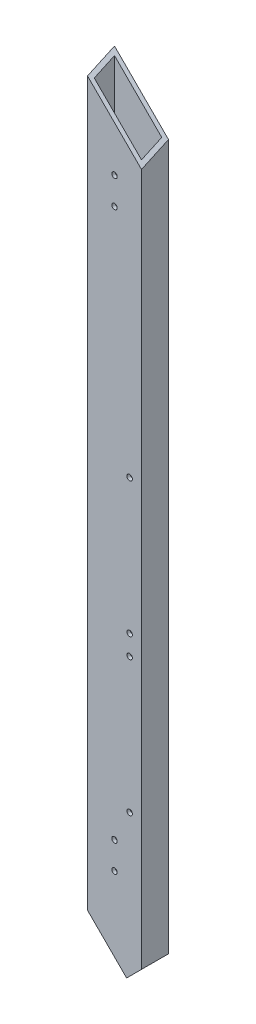
ISO-10303-21;
HEADER;
FILE_DESCRIPTION(('STEP AP214'),'2;1');
FILE_NAME('part.step','',(''),(''),'','','');
FILE_SCHEMA(('AUTOMOTIVE_DESIGN { 1 0 10303 214 1 1 1 1 }'));
ENDSEC;
DATA;
#1=APPLICATION_CONTEXT('core data for automotive mechanical design processes');
#2=APPLICATION_PROTOCOL_DEFINITION('international standard','automotive_design',2000,#1);
#3=PRODUCT_CONTEXT('',#1,'mechanical');
#4=PRODUCT('Part','Part','',(#3));
#5=PRODUCT_RELATED_PRODUCT_CATEGORY('part','',(#4));
#6=PRODUCT_DEFINITION_FORMATION('','',#4);
#7=PRODUCT_DEFINITION_CONTEXT('part definition',#1,'design');
#8=PRODUCT_DEFINITION('design','',#6,#7);
#9=PRODUCT_DEFINITION_SHAPE('','',#8);
#10=(LENGTH_UNIT() NAMED_UNIT(*) SI_UNIT(.MILLI.,.METRE.));
#11=(NAMED_UNIT(*) PLANE_ANGLE_UNIT() SI_UNIT($,.RADIAN.));
#12=(NAMED_UNIT(*) SI_UNIT($,.STERADIAN.) SOLID_ANGLE_UNIT());
#13=UNCERTAINTY_MEASURE_WITH_UNIT(LENGTH_MEASURE(1.E-05),#10,'distance_accuracy_value','');
#14=(GEOMETRIC_REPRESENTATION_CONTEXT(3) GLOBAL_UNCERTAINTY_ASSIGNED_CONTEXT((#13)) GLOBAL_UNIT_ASSIGNED_CONTEXT((#10,
#11,#12)) REPRESENTATION_CONTEXT('',''));
#15=CARTESIAN_POINT('',(0.,0.,0.));
#16=DIRECTION('',(0.,0.,1.));
#17=DIRECTION('',(1.,0.,0.));
#18=AXIS2_PLACEMENT_3D('',#15,#16,#17);
#19=CARTESIAN_POINT('',(25.4,728.3704,12.7));
#20=DIRECTION('',(-1.,0.,0.));
#21=DIRECTION('',(0.,0.,-1.));
#22=AXIS2_PLACEMENT_3D('',#19,#20,#21);
#23=PLANE('',#22);
#24=DIRECTION('',(0.,-1.,0.));
#25=VECTOR('',#24,1.);
#26=CARTESIAN_POINT('',(25.4,728.3704,38.1));
#27=LINE('',#26,#25);
#28=CARTESIAN_POINT('',(25.4,665.898951636196,38.1));
#29=VERTEX_POINT('',#28);
#30=CARTESIAN_POINT('',(25.4,13.9954000000001,38.1));
#31=VERTEX_POINT('',#30);
#32=EDGE_CURVE('E40',#29,#31,#27,.T.);
#33=ORIENTED_EDGE('',*,*,#32,.T.);
#34=DIRECTION('',(0.,0.,-1.));
#35=VECTOR('',#34,1.);
#36=CARTESIAN_POINT('',(25.4,13.9954000000001,38.1));
#37=LINE('',#36,#35);
#38=CARTESIAN_POINT('',(25.4,13.9954000000001,12.7));
#39=VERTEX_POINT('',#38);
#40=EDGE_CURVE('E126',#31,#39,#37,.T.);
#41=ORIENTED_EDGE('',*,*,#40,.T.);
#42=DIRECTION('',(0.,-1.,0.));
#43=VECTOR('',#42,1.);
#44=CARTESIAN_POINT('',(25.4,728.3704,12.7));
#45=LINE('',#44,#43);
#46=CARTESIAN_POINT('',(25.4,677.570400000001,12.7));
#47=VERTEX_POINT('',#46);
#48=EDGE_CURVE('E156',#47,#39,#45,.T.);
#49=ORIENTED_EDGE('',*,*,#48,.F.);
#50=DIRECTION('',(0.,0.4175349702472,-0.908660854566031));
#51=VECTOR('',#50,1.);
#52=CARTESIAN_POINT('',(25.4,686.426640930071,-6.5734022901014));
#53=LINE('',#52,#51);
#54=EDGE_CURVE('E249',#29,#47,#53,.T.);
#55=ORIENTED_EDGE('',*,*,#54,.F.);
#56=EDGE_LOOP('',(#33,#41,#49,#55));
#57=FACE_BOUND('',#56,.T.);
#58=ADVANCED_FACE('F32',(#57),#23,.F.);
#59=CARTESIAN_POINT('',(-25.4,728.3704,38.1));
#60=DIRECTION('',(0.,0.,-1.));
#61=DIRECTION('',(1.,0.,0.));
#62=AXIS2_PLACEMENT_3D('',#59,#60,#61);
#63=PLANE('',#62);
#64=CARTESIAN_POINT('',(14.236699999998,136.398000000002,38.1));
#65=DIRECTION('',(0.,0.,1.));
#66=DIRECTION('',(1.,0.,0.));
#67=AXIS2_PLACEMENT_3D('',#64,#65,#66);
#68=CIRCLE('',#67,2.57975099999999);
#69=CARTESIAN_POINT('',(16.816450999998,136.398000000002,38.1));
#70=VERTEX_POINT('',#69);
#71=EDGE_CURVE('E306',#70,#70,#68,.T.);
#72=ORIENTED_EDGE('',*,*,#71,.F.);
#73=EDGE_LOOP('',(#72));
#74=FACE_BOUND('',#73,.T.);
#75=CARTESIAN_POINT('',(14.2366999999957,282.194,38.1));
#76=DIRECTION('',(0.,0.,1.));
#77=DIRECTION('',(1.,0.,0.));
#78=AXIS2_PLACEMENT_3D('',#75,#76,#77);
#79=CIRCLE('',#78,2.57975099999999);
#80=CARTESIAN_POINT('',(16.8164509999957,282.194,38.1));
#81=VERTEX_POINT('',#80);
#82=EDGE_CURVE('E310',#81,#81,#79,.T.);
#83=ORIENTED_EDGE('',*,*,#82,.F.);
#84=EDGE_LOOP('',(#83));
#85=FACE_BOUND('',#84,.T.);
#86=CARTESIAN_POINT('',(3.46944695195361E-13,106.894373579666,38.1));
#87=DIRECTION('',(0.,0.,1.));
#88=DIRECTION('',(1.,0.,0.));
#89=AXIS2_PLACEMENT_3D('',#86,#87,#88);
#90=CIRCLE('',#89,2.57975099999999);
#91=CARTESIAN_POINT('',(2.57975100000033,106.894373579666,38.1));
#92=VERTEX_POINT('',#91);
#93=EDGE_CURVE('E314',#92,#92,#90,.T.);
#94=ORIENTED_EDGE('',*,*,#93,.F.);
#95=EDGE_LOOP('',(#94));
#96=FACE_BOUND('',#95,.T.);
#97=CARTESIAN_POINT('',(0.,81.4943735796658,38.1));
#98=DIRECTION('',(0.,0.,1.));
#99=DIRECTION('',(1.,0.,0.));
#100=AXIS2_PLACEMENT_3D('',#97,#98,#99);
#101=CIRCLE('',#100,2.57975099999999);
#102=CARTESIAN_POINT('',(2.57975100000002,81.4943735796658,38.1));
#103=VERTEX_POINT('',#102);
#104=EDGE_CURVE('E166',#103,#103,#101,.T.);
#105=ORIENTED_EDGE('',*,*,#104,.F.);
#106=EDGE_LOOP('',(#105));
#107=FACE_BOUND('',#106,.T.);
#108=CARTESIAN_POINT('',(14.2367000000168,409.19399999998,38.1));
#109=DIRECTION('',(0.,0.,-1.));
#110=DIRECTION('',(-1.,0.,0.));
#111=AXIS2_PLACEMENT_3D('',#108,#109,#110);
#112=CIRCLE('',#111,2.57975099999999);
#113=CARTESIAN_POINT('',(11.6569490000168,409.19399999998,38.1));
#114=VERTEX_POINT('',#113);
#115=EDGE_CURVE('E170',#114,#114,#112,.T.);
#116=ORIENTED_EDGE('',*,*,#115,.T.);
#117=EDGE_LOOP('',(#116));
#118=FACE_BOUND('',#117,.T.);
#119=CARTESIAN_POINT('',(14.2367000000077,263.39799999998,38.1));
#120=DIRECTION('',(0.,0.,-1.));
#121=DIRECTION('',(-1.,0.,0.));
#122=AXIS2_PLACEMENT_3D('',#119,#120,#121);
#123=CIRCLE('',#122,2.57975099999999);
#124=CARTESIAN_POINT('',(11.6569490000077,263.39799999998,38.1));
#125=VERTEX_POINT('',#124);
#126=EDGE_CURVE('E193',#125,#125,#123,.T.);
#127=ORIENTED_EDGE('',*,*,#126,.T.);
#128=EDGE_LOOP('',(#127));
#129=FACE_BOUND('',#128,.T.);
#130=CARTESIAN_POINT('',(3.58740814832004E-12,648.476590260015,38.1));
#131=DIRECTION('',(0.,0.,-1.));
#132=DIRECTION('',(-1.,0.,0.));
#133=AXIS2_PLACEMENT_3D('',#130,#131,#132);
#134=CIRCLE('',#133,2.57975099999999);
#135=CARTESIAN_POINT('',(-2.5797509999964,648.476590260015,38.1));
#136=VERTEX_POINT('',#135);
#137=EDGE_CURVE('E205',#136,#136,#134,.T.);
#138=ORIENTED_EDGE('',*,*,#137,.T.);
#139=EDGE_LOOP('',(#138));
#140=FACE_BOUND('',#139,.T.);
#141=CARTESIAN_POINT('',(3.81639164714898E-12,623.076590260015,38.1));
#142=DIRECTION('',(0.,0.,-1.));
#143=DIRECTION('',(-1.,0.,0.));
#144=AXIS2_PLACEMENT_3D('',#141,#142,#143);
#145=CIRCLE('',#144,2.57975099999999);
#146=CARTESIAN_POINT('',(-2.57975099999617,623.076590260015,38.1));
#147=VERTEX_POINT('',#146);
#148=EDGE_CURVE('E217',#147,#147,#145,.T.);
#149=ORIENTED_EDGE('',*,*,#148,.T.);
#150=EDGE_LOOP('',(#149));
#151=FACE_BOUND('',#150,.T.);
#152=DIRECTION('',(0.,-1.,0.));
#153=VECTOR('',#152,1.);
#154=CARTESIAN_POINT('',(-25.4,728.3704,38.1));
#155=LINE('',#154,#153);
#156=CARTESIAN_POINT('',(-25.4,716.698951636195,38.1));
#157=VERTEX_POINT('',#156);
#158=CARTESIAN_POINT('',(-25.4,36.8045999999998,38.1));
#159=VERTEX_POINT('',#158);
#160=EDGE_CURVE('E135',#157,#159,#155,.T.);
#161=ORIENTED_EDGE('',*,*,#160,.T.);
#162=DIRECTION('',(-0.707106781186548,0.707106781186548,0.));
#163=VECTOR('',#162,1.);
#164=CARTESIAN_POINT('',(5.7023,5.7023,38.1));
#165=LINE('',#164,#163);
#166=CARTESIAN_POINT('',(11.4046,0.,38.1));
#167=VERTEX_POINT('',#166);
#168=EDGE_CURVE('E113',#167,#159,#165,.T.);
#169=ORIENTED_EDGE('',*,*,#168,.F.);
#170=DIRECTION('',(0.707106781186546,0.707106781186549,0.));
#171=VECTOR('',#170,1.);
#172=CARTESIAN_POINT('',(5.70230000000003,-5.7023,38.1));
#173=LINE('',#172,#171);
#174=EDGE_CURVE('E123',#167,#31,#173,.T.);
#175=ORIENTED_EDGE('',*,*,#174,.T.);
#176=ORIENTED_EDGE('',*,*,#32,.F.);
#177=DIRECTION('',(-0.707106781186556,0.707106781186539,0.));
#178=VECTOR('',#177,1.);
#179=CARTESIAN_POINT('',(483.979529996083,207.319421640124,38.1));
#180=LINE('',#179,#178);
#181=EDGE_CURVE('E237',#29,#157,#180,.T.);
#182=ORIENTED_EDGE('',*,*,#181,.T.);
#183=EDGE_LOOP('',(#161,#169,#175,#176,#182));
#184=FACE_BOUND('',#183,.T.);
#185=ADVANCED_FACE('F132',(#74,#85,#96,#107,#118,#129,#140,#151,#184),#63,.F.);
#186=CARTESIAN_POINT('',(-25.4,728.3704,12.7));
#187=DIRECTION('',(0.,0.,1.));
#188=DIRECTION('',(-1.,0.,0.));
#189=AXIS2_PLACEMENT_3D('',#186,#187,#188);
#190=PLANE('',#189);
#191=CARTESIAN_POINT('',(14.236699999998,136.398000000002,12.7));
#192=DIRECTION('',(0.,0.,1.));
#193=DIRECTION('',(1.,0.,0.));
#194=AXIS2_PLACEMENT_3D('',#191,#192,#193);
#195=CIRCLE('',#194,2.57975099999998);
#196=CARTESIAN_POINT('',(16.816450999998,136.398000000002,12.7));
#197=VERTEX_POINT('',#196);
#198=EDGE_CURVE('E425',#197,#197,#195,.T.);
#199=ORIENTED_EDGE('',*,*,#198,.T.);
#200=EDGE_LOOP('',(#199));
#201=FACE_BOUND('',#200,.T.);
#202=CARTESIAN_POINT('',(14.2366999999957,282.194,12.7));
#203=DIRECTION('',(0.,0.,1.));
#204=DIRECTION('',(1.,0.,0.));
#205=AXIS2_PLACEMENT_3D('',#202,#203,#204);
#206=CIRCLE('',#205,2.57975099999998);
#207=CARTESIAN_POINT('',(16.8164509999957,282.194,12.7));
#208=VERTEX_POINT('',#207);
#209=EDGE_CURVE('E433',#208,#208,#206,.T.);
#210=ORIENTED_EDGE('',*,*,#209,.T.);
#211=EDGE_LOOP('',(#210));
#212=FACE_BOUND('',#211,.T.);
#213=CARTESIAN_POINT('',(3.46944695195361E-13,106.894373579666,12.7));
#214=DIRECTION('',(0.,0.,1.));
#215=DIRECTION('',(1.,0.,0.));
#216=AXIS2_PLACEMENT_3D('',#213,#214,#215);
#217=CIRCLE('',#216,2.57975099999999);
#218=CARTESIAN_POINT('',(2.57975100000033,106.894373579666,12.7));
#219=VERTEX_POINT('',#218);
#220=EDGE_CURVE('E440',#219,#219,#217,.T.);
#221=ORIENTED_EDGE('',*,*,#220,.T.);
#222=EDGE_LOOP('',(#221));
#223=FACE_BOUND('',#222,.T.);
#224=CARTESIAN_POINT('',(0.,81.4943735796658,12.7));
#225=DIRECTION('',(0.,0.,1.));
#226=DIRECTION('',(1.,0.,0.));
#227=AXIS2_PLACEMENT_3D('',#224,#225,#226);
#228=CIRCLE('',#227,2.57975099999999);
#229=CARTESIAN_POINT('',(2.57975100000002,81.4943735796658,12.7));
#230=VERTEX_POINT('',#229);
#231=EDGE_CURVE('E173',#230,#230,#228,.T.);
#232=ORIENTED_EDGE('',*,*,#231,.T.);
#233=EDGE_LOOP('',(#232));
#234=FACE_BOUND('',#233,.T.);
#235=CARTESIAN_POINT('',(14.2367000000168,409.19399999998,12.7));
#236=DIRECTION('',(0.,0.,-1.));
#237=DIRECTION('',(-1.,0.,0.));
#238=AXIS2_PLACEMENT_3D('',#235,#236,#237);
#239=CIRCLE('',#238,2.57975099999998);
#240=CARTESIAN_POINT('',(11.6569490000168,409.19399999998,12.7));
#241=VERTEX_POINT('',#240);
#242=EDGE_CURVE('E184',#241,#241,#239,.T.);
#243=ORIENTED_EDGE('',*,*,#242,.F.);
#244=EDGE_LOOP('',(#243));
#245=FACE_BOUND('',#244,.T.);
#246=CARTESIAN_POINT('',(14.2367000000077,263.39799999998,12.7));
#247=DIRECTION('',(0.,0.,-1.));
#248=DIRECTION('',(-1.,0.,0.));
#249=AXIS2_PLACEMENT_3D('',#246,#247,#248);
#250=CIRCLE('',#249,2.57975099999998);
#251=CARTESIAN_POINT('',(11.6569490000077,263.39799999998,12.7));
#252=VERTEX_POINT('',#251);
#253=EDGE_CURVE('E196',#252,#252,#250,.T.);
#254=ORIENTED_EDGE('',*,*,#253,.F.);
#255=EDGE_LOOP('',(#254));
#256=FACE_BOUND('',#255,.T.);
#257=CARTESIAN_POINT('',(3.58740814832004E-12,648.476590260015,12.7));
#258=DIRECTION('',(0.,0.,-1.));
#259=DIRECTION('',(-1.,0.,0.));
#260=AXIS2_PLACEMENT_3D('',#257,#258,#259);
#261=CIRCLE('',#260,2.57975099999999);
#262=CARTESIAN_POINT('',(-2.5797509999964,648.476590260015,12.7));
#263=VERTEX_POINT('',#262);
#264=EDGE_CURVE('E208',#263,#263,#261,.T.);
#265=ORIENTED_EDGE('',*,*,#264,.F.);
#266=EDGE_LOOP('',(#265));
#267=FACE_BOUND('',#266,.T.);
#268=CARTESIAN_POINT('',(3.81639164714898E-12,623.076590260015,12.7));
#269=DIRECTION('',(0.,0.,-1.));
#270=DIRECTION('',(-1.,0.,0.));
#271=AXIS2_PLACEMENT_3D('',#268,#269,#270);
#272=CIRCLE('',#271,2.57975099999999);
#273=CARTESIAN_POINT('',(-2.57975099999617,623.076590260015,12.7));
#274=VERTEX_POINT('',#273);
#275=EDGE_CURVE('E220',#274,#274,#272,.T.);
#276=ORIENTED_EDGE('',*,*,#275,.F.);
#277=EDGE_LOOP('',(#276));
#278=FACE_BOUND('',#277,.T.);
#279=DIRECTION('',(0.,-1.,0.));
#280=VECTOR('',#279,1.);
#281=CARTESIAN_POINT('',(-25.4,728.3704,12.7));
#282=LINE('',#281,#280);
#283=CARTESIAN_POINT('',(-25.4,728.3704,12.7));
#284=VERTEX_POINT('',#283);
#285=CARTESIAN_POINT('',(-25.4,48.4760483638055,12.7));
#286=VERTEX_POINT('',#285);
#287=EDGE_CURVE('E159',#284,#286,#282,.T.);
#288=ORIENTED_EDGE('',*,*,#287,.F.);
#289=DIRECTION('',(0.707106781186556,-0.707106781186539,0.));
#290=VECTOR('',#289,1.);
#291=CARTESIAN_POINT('',(351.4852,351.485200000009,12.7));
#292=LINE('',#291,#290);
#293=EDGE_CURVE('E136',#284,#47,#292,.T.);
#294=ORIENTED_EDGE('',*,*,#293,.T.);
#295=ORIENTED_EDGE('',*,*,#48,.T.);
#296=DIRECTION('',(0.707106781186546,0.707106781186549,0.));
#297=VECTOR('',#296,1.);
#298=CARTESIAN_POINT('',(5.70230000000003,-5.7023,12.7));
#299=LINE('',#298,#297);
#300=CARTESIAN_POINT('',(17.2403241819028,5.83572418190286,12.7));
#301=VERTEX_POINT('',#300);
#302=EDGE_CURVE('E130',#301,#39,#299,.T.);
#303=ORIENTED_EDGE('',*,*,#302,.F.);
#304=DIRECTION('',(0.707106781186549,-0.707106781186546,0.));
#305=VECTOR('',#304,1.);
#306=CARTESIAN_POINT('',(-497.974929996078,521.050978359881,12.7));
#307=LINE('',#306,#305);
#308=EDGE_CURVE('E119',#286,#301,#307,.T.);
#309=ORIENTED_EDGE('',*,*,#308,.F.);
#310=EDGE_LOOP('',(#288,#294,#295,#303,#309));
#311=FACE_BOUND('',#310,.T.);
#312=ADVANCED_FACE('F280',(#201,#212,#223,#234,#245,#256,#267,#278,#311),#190,.F.);
#313=CARTESIAN_POINT('',(-22.225,728.3704,15.875));
#314=DIRECTION('',(0.,0.,1.));
#315=DIRECTION('',(-1.,0.,0.));
#316=AXIS2_PLACEMENT_3D('',#313,#314,#315);
#317=PLANE('',#316);
#318=CARTESIAN_POINT('',(14.236699999998,136.398000000002,15.875));
#319=DIRECTION('',(0.,0.,1.));
#320=DIRECTION('',(1.,0.,0.));
#321=AXIS2_PLACEMENT_3D('',#318,#319,#320);
#322=CIRCLE('',#321,2.57975099999999);
#323=CARTESIAN_POINT('',(16.816450999998,136.398000000002,15.875));
#324=VERTEX_POINT('',#323);
#325=EDGE_CURVE('E35',#324,#324,#322,.T.);
#326=ORIENTED_EDGE('',*,*,#325,.F.);
#327=EDGE_LOOP('',(#326));
#328=FACE_BOUND('',#327,.T.);
#329=CARTESIAN_POINT('',(14.2366999999957,282.194,15.875));
#330=DIRECTION('',(0.,0.,1.));
#331=DIRECTION('',(1.,0.,0.));
#332=AXIS2_PLACEMENT_3D('',#329,#330,#331);
#333=CIRCLE('',#332,2.57975099999999);
#334=CARTESIAN_POINT('',(16.8164509999957,282.194,15.875));
#335=VERTEX_POINT('',#334);
#336=EDGE_CURVE('E357',#335,#335,#333,.T.);
#337=ORIENTED_EDGE('',*,*,#336,.F.);
#338=EDGE_LOOP('',(#337));
#339=FACE_BOUND('',#338,.T.);
#340=CARTESIAN_POINT('',(3.46944695195361E-13,106.894373579666,15.875));
#341=DIRECTION('',(0.,0.,-1.));
#342=DIRECTION('',(-1.,0.,0.));
#343=AXIS2_PLACEMENT_3D('',#340,#341,#342);
#344=CIRCLE('',#343,2.57975099999999);
#345=CARTESIAN_POINT('',(-2.57975099999964,106.894373579666,15.875));
#346=VERTEX_POINT('',#345);
#347=EDGE_CURVE('E361',#346,#346,#344,.T.);
#348=ORIENTED_EDGE('',*,*,#347,.T.);
#349=EDGE_LOOP('',(#348));
#350=FACE_BOUND('',#349,.T.);
#351=CARTESIAN_POINT('',(0.,81.4943735796658,15.875));
#352=DIRECTION('',(0.,0.,-1.));
#353=DIRECTION('',(-1.,0.,0.));
#354=AXIS2_PLACEMENT_3D('',#351,#352,#353);
#355=CIRCLE('',#354,2.57975099999999);
#356=CARTESIAN_POINT('',(-2.57975099999995,81.4943735796658,15.875));
#357=VERTEX_POINT('',#356);
#358=EDGE_CURVE('E165',#357,#357,#355,.T.);
#359=ORIENTED_EDGE('',*,*,#358,.T.);
#360=EDGE_LOOP('',(#359));
#361=FACE_BOUND('',#360,.T.);
#362=CARTESIAN_POINT('',(14.2367000000168,409.19399999998,15.875));
#363=DIRECTION('',(0.,0.,-1.));
#364=DIRECTION('',(-1.,0.,0.));
#365=AXIS2_PLACEMENT_3D('',#362,#363,#364);
#366=CIRCLE('',#365,2.57975099999999);
#367=CARTESIAN_POINT('',(11.6569490000168,409.19399999998,15.875));
#368=VERTEX_POINT('',#367);
#369=EDGE_CURVE('E190',#368,#368,#366,.T.);
#370=ORIENTED_EDGE('',*,*,#369,.T.);
#371=EDGE_LOOP('',(#370));
#372=FACE_BOUND('',#371,.T.);
#373=CARTESIAN_POINT('',(14.2367000000077,263.39799999998,15.875));
#374=DIRECTION('',(0.,0.,-1.));
#375=DIRECTION('',(-1.,0.,0.));
#376=AXIS2_PLACEMENT_3D('',#373,#374,#375);
#377=CIRCLE('',#376,2.57975099999999);
#378=CARTESIAN_POINT('',(11.6569490000077,263.39799999998,15.875));
#379=VERTEX_POINT('',#378);
#380=EDGE_CURVE('E199',#379,#379,#377,.T.);
#381=ORIENTED_EDGE('',*,*,#380,.T.);
#382=EDGE_LOOP('',(#381));
#383=FACE_BOUND('',#382,.T.);
#384=CARTESIAN_POINT('',(3.58740814832004E-12,648.476590260015,15.875));
#385=DIRECTION('',(0.,0.,-1.));
#386=DIRECTION('',(-1.,0.,0.));
#387=AXIS2_PLACEMENT_3D('',#384,#385,#386);
#388=CIRCLE('',#387,2.57975099999999);
#389=CARTESIAN_POINT('',(-2.5797509999964,648.476590260015,15.875));
#390=VERTEX_POINT('',#389);
#391=EDGE_CURVE('E211',#390,#390,#388,.T.);
#392=ORIENTED_EDGE('',*,*,#391,.T.);
#393=EDGE_LOOP('',(#392));
#394=FACE_BOUND('',#393,.T.);
#395=CARTESIAN_POINT('',(3.81639164714898E-12,623.076590260015,15.875));
#396=DIRECTION('',(0.,0.,-1.));
#397=DIRECTION('',(-1.,0.,0.));
#398=AXIS2_PLACEMENT_3D('',#395,#396,#397);
#399=CIRCLE('',#398,2.57975099999999);
#400=CARTESIAN_POINT('',(-2.57975099999617,623.076590260015,15.875));
#401=VERTEX_POINT('',#400);
#402=EDGE_CURVE('E223',#401,#401,#399,.T.);
#403=ORIENTED_EDGE('',*,*,#402,.T.);
#404=EDGE_LOOP('',(#403));
#405=FACE_BOUND('',#404,.T.);
#406=DIRECTION('',(0.707106781186549,-0.707106781186546,0.));
#407=VECTOR('',#406,1.);
#408=CARTESIAN_POINT('',(-364.489141340835,386.106258659163,15.875));
#409=LINE('',#408,#407);
#410=CARTESIAN_POINT('',(-22.225,43.8421173183297,15.875));
#411=VERTEX_POINT('',#410);
#412=CARTESIAN_POINT('',(16.5108586591651,5.10625865916504,15.875));
#413=VERTEX_POINT('',#412);
#414=EDGE_CURVE('E232',#411,#413,#409,.T.);
#415=ORIENTED_EDGE('',*,*,#414,.T.);
#416=DIRECTION('',(-0.707106781186546,-0.707106781186549,0.));
#417=VECTOR('',#416,1.);
#418=CARTESIAN_POINT('',(358.775,347.370400000002,15.875));
#419=LINE('',#418,#417);
#420=CARTESIAN_POINT('',(22.225,10.8204,15.875));
#421=VERTEX_POINT('',#420);
#422=EDGE_CURVE('E137',#421,#413,#419,.T.);
#423=ORIENTED_EDGE('',*,*,#422,.F.);
#424=DIRECTION('',(0.,-1.,0.));
#425=VECTOR('',#424,1.);
#426=CARTESIAN_POINT('',(22.225,728.3704,15.875));
#427=LINE('',#426,#425);
#428=CARTESIAN_POINT('',(22.225,679.286468954526,15.875));
#429=VERTEX_POINT('',#428);
#430=EDGE_CURVE('E150',#429,#421,#427,.T.);
#431=ORIENTED_EDGE('',*,*,#430,.F.);
#432=DIRECTION('',(-0.707106781186556,0.707106781186539,0.));
#433=VECTOR('',#432,1.);
#434=CARTESIAN_POINT('',(-24.5419655227377,726.053434477262,15.875));
#435=LINE('',#434,#433);
#436=CARTESIAN_POINT('',(-22.225,723.736468954525,15.875));
#437=VERTEX_POINT('',#436);
#438=EDGE_CURVE('E244',#429,#437,#435,.T.);
#439=ORIENTED_EDGE('',*,*,#438,.T.);
#440=DIRECTION('',(0.,-1.,0.));
#441=VECTOR('',#440,1.);
#442=CARTESIAN_POINT('',(-22.225,728.3704,15.875));
#443=LINE('',#442,#441);
#444=EDGE_CURVE('E153',#437,#411,#443,.T.);
#445=ORIENTED_EDGE('',*,*,#444,.T.);
#446=EDGE_LOOP('',(#415,#423,#431,#439,#445));
#447=FACE_BOUND('',#446,.T.);
#448=ADVANCED_FACE('F263',(#328,#339,#350,#361,#372,#383,#394,#405,#447),#317,.T.);
#449=CARTESIAN_POINT('',(22.225,728.3704,15.875));
#450=DIRECTION('',(-1.,0.,0.));
#451=DIRECTION('',(0.,0.,-1.));
#452=AXIS2_PLACEMENT_3D('',#449,#450,#451);
#453=PLANE('',#452);
#454=DIRECTION('',(0.,0.4175349702472,-0.908660854566031));
#455=VECTOR('',#454,1.);
#456=CARTESIAN_POINT('',(22.225,687.84353822881,-2.74732970509944));
#457=LINE('',#456,#455);
#458=CARTESIAN_POINT('',(22.225,670.532882681672,34.925));
#459=VERTEX_POINT('',#458);
#460=EDGE_CURVE('E242',#459,#429,#457,.T.);
#461=ORIENTED_EDGE('',*,*,#460,.T.);
#462=ORIENTED_EDGE('',*,*,#430,.T.);
#463=DIRECTION('',(0.,0.,-1.));
#464=VECTOR('',#463,1.);
#465=CARTESIAN_POINT('',(22.225,10.8204,15.8749999999999));
#466=LINE('',#465,#464);
#467=CARTESIAN_POINT('',(22.225,10.8204,34.925));
#468=VERTEX_POINT('',#467);
#469=EDGE_CURVE('E141',#468,#421,#466,.T.);
#470=ORIENTED_EDGE('',*,*,#469,.F.);
#471=DIRECTION('',(0.,-1.,0.));
#472=VECTOR('',#471,1.);
#473=CARTESIAN_POINT('',(22.225,728.3704,34.925));
#474=LINE('',#473,#472);
#475=EDGE_CURVE('E147',#459,#468,#474,.T.);
#476=ORIENTED_EDGE('',*,*,#475,.F.);
#477=EDGE_LOOP('',(#461,#462,#470,#476));
#478=FACE_BOUND('',#477,.T.);
#479=ADVANCED_FACE('F260',(#478),#453,.T.);
#480=CARTESIAN_POINT('',(-22.225,728.3704,34.925));
#481=DIRECTION('',(0.,0.,-1.));
#482=DIRECTION('',(1.,0.,0.));
#483=AXIS2_PLACEMENT_3D('',#480,#481,#482);
#484=PLANE('',#483);
#485=CARTESIAN_POINT('',(14.236699999998,136.398000000002,34.925));
#486=DIRECTION('',(0.,0.,-1.));
#487=DIRECTION('',(-1.,0.,0.));
#488=AXIS2_PLACEMENT_3D('',#485,#486,#487);
#489=CIRCLE('',#488,2.57975099999999);
#490=CARTESIAN_POINT('',(11.656948999998,136.398000000002,34.925));
#491=VERTEX_POINT('',#490);
#492=EDGE_CURVE('E427',#491,#491,#489,.T.);
#493=ORIENTED_EDGE('',*,*,#492,.F.);
#494=EDGE_LOOP('',(#493));
#495=FACE_BOUND('',#494,.T.);
#496=CARTESIAN_POINT('',(14.2366999999957,282.194,34.925));
#497=DIRECTION('',(0.,0.,-1.));
#498=DIRECTION('',(-1.,0.,0.));
#499=AXIS2_PLACEMENT_3D('',#496,#497,#498);
#500=CIRCLE('',#499,2.57975099999999);
#501=CARTESIAN_POINT('',(11.6569489999957,282.194,34.925));
#502=VERTEX_POINT('',#501);
#503=EDGE_CURVE('E437',#502,#502,#500,.T.);
#504=ORIENTED_EDGE('',*,*,#503,.F.);
#505=EDGE_LOOP('',(#504));
#506=FACE_BOUND('',#505,.T.);
#507=CARTESIAN_POINT('',(3.46944695195361E-13,106.894373579666,34.925));
#508=DIRECTION('',(0.,0.,1.));
#509=DIRECTION('',(1.,0.,0.));
#510=AXIS2_PLACEMENT_3D('',#507,#508,#509);
#511=CIRCLE('',#510,2.57975099999999);
#512=CARTESIAN_POINT('',(2.57975100000033,106.894373579666,34.925));
#513=VERTEX_POINT('',#512);
#514=EDGE_CURVE('E178',#513,#513,#511,.T.);
#515=ORIENTED_EDGE('',*,*,#514,.T.);
#516=EDGE_LOOP('',(#515));
#517=FACE_BOUND('',#516,.T.);
#518=CARTESIAN_POINT('',(0.,81.4943735796658,34.925));
#519=DIRECTION('',(0.,0.,1.));
#520=DIRECTION('',(1.,0.,0.));
#521=AXIS2_PLACEMENT_3D('',#518,#519,#520);
#522=CIRCLE('',#521,2.57975099999999);
#523=CARTESIAN_POINT('',(2.57975100000002,81.4943735796658,34.925));
#524=VERTEX_POINT('',#523);
#525=EDGE_CURVE('E163',#524,#524,#522,.T.);
#526=ORIENTED_EDGE('',*,*,#525,.T.);
#527=EDGE_LOOP('',(#526));
#528=FACE_BOUND('',#527,.T.);
#529=CARTESIAN_POINT('',(14.2367000000168,409.19399999998,34.925));
#530=DIRECTION('',(0.,0.,1.));
#531=DIRECTION('',(1.,0.,0.));
#532=AXIS2_PLACEMENT_3D('',#529,#530,#531);
#533=CIRCLE('',#532,2.57975099999999);
#534=CARTESIAN_POINT('',(16.8164510000167,409.19399999998,34.925));
#535=VERTEX_POINT('',#534);
#536=EDGE_CURVE('E187',#535,#535,#533,.T.);
#537=ORIENTED_EDGE('',*,*,#536,.T.);
#538=EDGE_LOOP('',(#537));
#539=FACE_BOUND('',#538,.T.);
#540=CARTESIAN_POINT('',(14.2367000000077,263.39799999998,34.925));
#541=DIRECTION('',(0.,0.,1.));
#542=DIRECTION('',(1.,0.,0.));
#543=AXIS2_PLACEMENT_3D('',#540,#541,#542);
#544=CIRCLE('',#543,2.57975099999999);
#545=CARTESIAN_POINT('',(16.8164510000076,263.39799999998,34.925));
#546=VERTEX_POINT('',#545);
#547=EDGE_CURVE('E202',#546,#546,#544,.T.);
#548=ORIENTED_EDGE('',*,*,#547,.T.);
#549=EDGE_LOOP('',(#548));
#550=FACE_BOUND('',#549,.T.);
#551=CARTESIAN_POINT('',(3.58740814832004E-12,648.476590260015,34.925));
#552=DIRECTION('',(0.,0.,1.));
#553=DIRECTION('',(1.,0.,0.));
#554=AXIS2_PLACEMENT_3D('',#551,#552,#553);
#555=CIRCLE('',#554,2.57975099999999);
#556=CARTESIAN_POINT('',(2.57975100000357,648.476590260015,34.925));
#557=VERTEX_POINT('',#556);
#558=EDGE_CURVE('E214',#557,#557,#555,.T.);
#559=ORIENTED_EDGE('',*,*,#558,.T.);
#560=EDGE_LOOP('',(#559));
#561=FACE_BOUND('',#560,.T.);
#562=CARTESIAN_POINT('',(3.81639164714898E-12,623.076590260015,34.925));
#563=DIRECTION('',(0.,0.,1.));
#564=DIRECTION('',(1.,0.,0.));
#565=AXIS2_PLACEMENT_3D('',#562,#563,#564);
#566=CIRCLE('',#565,2.57975099999999);
#567=CARTESIAN_POINT('',(2.5797510000038,623.076590260015,34.925));
#568=VERTEX_POINT('',#567);
#569=EDGE_CURVE('E120',#568,#568,#566,.T.);
#570=ORIENTED_EDGE('',*,*,#569,.T.);
#571=EDGE_LOOP('',(#570));
#572=FACE_BOUND('',#571,.T.);
#573=DIRECTION('',(-0.707106781186549,0.707106781186546,0.));
#574=VECTOR('',#573,1.);
#575=CARTESIAN_POINT('',(-368.865934477262,381.729465522736,34.925));
#576=LINE('',#575,#574);
#577=CARTESIAN_POINT('',(12.1340655227379,0.729465522737861,34.925));
#578=VERTEX_POINT('',#577);
#579=CARTESIAN_POINT('',(-22.225,35.0885310454755,34.925));
#580=VERTEX_POINT('',#579);
#581=EDGE_CURVE('E116',#578,#580,#576,.T.);
#582=ORIENTED_EDGE('',*,*,#581,.T.);
#583=DIRECTION('',(0.,-1.,0.));
#584=VECTOR('',#583,1.);
#585=CARTESIAN_POINT('',(-22.225,728.3704,34.925));
#586=LINE('',#585,#584);
#587=CARTESIAN_POINT('',(-22.225,714.98288268167,34.925));
#588=VERTEX_POINT('',#587);
#589=EDGE_CURVE('E139',#588,#580,#586,.T.);
#590=ORIENTED_EDGE('',*,*,#589,.F.);
#591=DIRECTION('',(0.707106781186556,-0.707106781186539,0.));
#592=VECTOR('',#591,1.);
#593=CARTESIAN_POINT('',(-28.9187586591648,721.676641340835,34.925));
#594=LINE('',#593,#592);
#595=EDGE_CURVE('E240',#588,#459,#594,.T.);
#596=ORIENTED_EDGE('',*,*,#595,.T.);
#597=ORIENTED_EDGE('',*,*,#475,.T.);
#598=DIRECTION('',(0.707106781186546,0.707106781186549,0.));
#599=VECTOR('',#598,1.);
#600=CARTESIAN_POINT('',(358.775,347.370400000002,34.925));
#601=LINE('',#600,#599);
#602=EDGE_CURVE('E254',#578,#468,#601,.T.);
#603=ORIENTED_EDGE('',*,*,#602,.F.);
#604=EDGE_LOOP('',(#582,#590,#596,#597,#603));
#605=FACE_BOUND('',#604,.T.);
#606=ADVANCED_FACE('F268',(#495,#506,#517,#528,#539,#550,#561,#572,#605),#484,.T.);
#607=CARTESIAN_POINT('',(-25.4,728.3704,12.7));
#608=DIRECTION('',(1.,0.,0.));
#609=DIRECTION('',(0.,0.,1.));
#610=AXIS2_PLACEMENT_3D('',#607,#608,#609);
#611=PLANE('',#610);
#612=ORIENTED_EDGE('',*,*,#160,.F.);
#613=DIRECTION('',(0.,-0.4175349702472,0.908660854566031));
#614=VECTOR('',#613,1.);
#615=CARTESIAN_POINT('',(-25.4,728.3704,12.7000000000001));
#616=LINE('',#615,#614);
#617=EDGE_CURVE('E247',#284,#157,#616,.T.);
#618=ORIENTED_EDGE('',*,*,#617,.F.);
#619=ORIENTED_EDGE('',*,*,#287,.T.);
#620=DIRECTION('',(0.,0.417534970247202,-0.90866085456603));
#621=VECTOR('',#620,1.);
#622=CARTESIAN_POINT('',(-25.4,167.00573704656,-245.250341611269));
#623=LINE('',#622,#621);
#624=EDGE_CURVE('E235',#159,#286,#623,.T.);
#625=ORIENTED_EDGE('',*,*,#624,.F.);
#626=EDGE_LOOP('',(#612,#618,#619,#625));
#627=FACE_BOUND('',#626,.T.);
#628=ADVANCED_FACE('F283',(#627),#611,.F.);
#629=CARTESIAN_POINT('',(-22.225,728.3704,15.875));
#630=DIRECTION('',(1.,0.,0.));
#631=DIRECTION('',(0.,0.,1.));
#632=AXIS2_PLACEMENT_3D('',#629,#630,#631);
#633=PLANE('',#632);
#634=DIRECTION('',(0.,0.417534970247202,-0.90866085456603));
#635=VECTOR('',#634,1.);
#636=CARTESIAN_POINT('',(-22.225,163.179664461558,-243.83344431253));
#637=LINE('',#636,#635);
#638=EDGE_CURVE('E229',#580,#411,#637,.T.);
#639=ORIENTED_EDGE('',*,*,#638,.T.);
#640=ORIENTED_EDGE('',*,*,#444,.F.);
#641=DIRECTION('',(0.,-0.4175349702472,0.908660854566031));
#642=VECTOR('',#641,1.);
#643=CARTESIAN_POINT('',(-22.225,724.544327414998,14.1168972987394));
#644=LINE('',#643,#642);
#645=EDGE_CURVE('E54',#437,#588,#644,.T.);
#646=ORIENTED_EDGE('',*,*,#645,.T.);
#647=ORIENTED_EDGE('',*,*,#589,.T.);
#648=EDGE_LOOP('',(#639,#640,#646,#647));
#649=FACE_BOUND('',#648,.T.);
#650=ADVANCED_FACE('F266',(#649),#633,.T.);
#651=CARTESIAN_POINT('',(5.70230000000003,-5.7023,38.1));
#652=DIRECTION('',(0.707106781186549,-0.707106781186546,0.));
#653=DIRECTION('',(0.707106781186546,0.707106781186549,0.));
#654=AXIS2_PLACEMENT_3D('',#651,#652,#653);
#655=PLANE('',#654);
#656=DIRECTION('',(0.218508012224406,0.218508012224407,-0.951056516295156));
#657=VECTOR('',#656,1.);
#658=CARTESIAN_POINT('',(11.4046,0.,38.1));
#659=LINE('',#658,#657);
#660=EDGE_CURVE('E109',#167,#578,#659,.T.);
#661=ORIENTED_EDGE('',*,*,#660,.T.);
#662=ORIENTED_EDGE('',*,*,#602,.T.);
#663=ORIENTED_EDGE('',*,*,#469,.T.);
#664=ORIENTED_EDGE('',*,*,#422,.T.);
#665=DIRECTION('',(0.218508012224406,0.218508012224407,-0.951056516295156));
#666=VECTOR('',#665,1.);
#667=CARTESIAN_POINT('',(10.8600788035122,-0.54452119648781,40.4700294872883));
#668=LINE('',#667,#666);
#669=EDGE_CURVE('E11',#413,#301,#668,.T.);
#670=ORIENTED_EDGE('',*,*,#669,.T.);
#671=ORIENTED_EDGE('',*,*,#302,.T.);
#672=ORIENTED_EDGE('',*,*,#40,.F.);
#673=ORIENTED_EDGE('',*,*,#174,.F.);
#674=EDGE_LOOP('',(#661,#662,#663,#664,#670,#671,#672,#673));
#675=FACE_BOUND('',#674,.T.);
#676=ADVANCED_FACE('F124',(#675),#655,.T.);
#677=CARTESIAN_POINT('',(489.815254177986,213.155145822027,12.7));
#678=DIRECTION('',(-0.67249851196395,-0.672498511963967,-0.309016994374942));
#679=DIRECTION('',(0.707106781186556,-0.707106781186539,0.));
#680=AXIS2_PLACEMENT_3D('',#677,#678,#679);
#681=PLANE('',#680);
#682=ORIENTED_EDGE('',*,*,#438,.F.);
#683=ORIENTED_EDGE('',*,*,#460,.F.);
#684=ORIENTED_EDGE('',*,*,#595,.F.);
#685=ORIENTED_EDGE('',*,*,#645,.F.);
#686=EDGE_LOOP('',(#682,#683,#684,#685));
#687=FACE_BOUND('',#686,.T.);
#688=ORIENTED_EDGE('',*,*,#181,.F.);
#689=ORIENTED_EDGE('',*,*,#54,.T.);
#690=ORIENTED_EDGE('',*,*,#293,.F.);
#691=ORIENTED_EDGE('',*,*,#617,.T.);
#692=EDGE_LOOP('',(#688,#689,#690,#691));
#693=FACE_BOUND('',#692,.T.);
#694=ADVANCED_FACE('F269',(#687,#693),#681,.F.);
#695=CARTESIAN_POINT('',(-503.810654177981,515.215254177978,38.1));
#696=DIRECTION('',(0.672498511963957,0.672498511963961,0.309016994374941));
#697=DIRECTION('',(-0.707106781186549,0.707106781186546,0.));
#698=AXIS2_PLACEMENT_3D('',#695,#696,#697);
#699=PLANE('',#698);
#700=ORIENTED_EDGE('',*,*,#168,.T.);
#701=ORIENTED_EDGE('',*,*,#624,.T.);
#702=ORIENTED_EDGE('',*,*,#308,.T.);
#703=ORIENTED_EDGE('',*,*,#669,.F.);
#704=ORIENTED_EDGE('',*,*,#414,.F.);
#705=ORIENTED_EDGE('',*,*,#638,.F.);
#706=ORIENTED_EDGE('',*,*,#581,.F.);
#707=ORIENTED_EDGE('',*,*,#660,.F.);
#708=EDGE_LOOP('',(#700,#701,#702,#703,#704,#705,#706,#707));
#709=FACE_BOUND('',#708,.T.);
#710=ADVANCED_FACE('F111',(#709),#699,.F.);
#711=CARTESIAN_POINT('',(3.81639164714898E-12,623.076590260015,38.1));
#712=DIRECTION('',(0.,0.,1.));
#713=DIRECTION('',(-1.,0.,0.));
#714=AXIS2_PLACEMENT_3D('',#711,#712,#713);
#715=CYLINDRICAL_SURFACE('',#714,2.57975099999999);
#716=ORIENTED_EDGE('',*,*,#402,.F.);
#717=EDGE_LOOP('',(#716));
#718=FACE_BOUND('',#717,.T.);
#719=ORIENTED_EDGE('',*,*,#275,.T.);
#720=EDGE_LOOP('',(#719));
#721=FACE_BOUND('',#720,.T.);
#722=ADVANCED_FACE('F327',(#718,#721),#715,.F.);
#723=ORIENTED_EDGE('',*,*,#569,.F.);
#724=EDGE_LOOP('',(#723));
#725=FACE_BOUND('',#724,.T.);
#726=ORIENTED_EDGE('',*,*,#148,.F.);
#727=EDGE_LOOP('',(#726));
#728=FACE_BOUND('',#727,.T.);
#729=ADVANCED_FACE('F324',(#725,#728),#715,.F.);
#730=CARTESIAN_POINT('',(3.58740814832004E-12,648.476590260015,38.1));
#731=DIRECTION('',(0.,0.,1.));
#732=DIRECTION('',(-1.,0.,0.));
#733=AXIS2_PLACEMENT_3D('',#730,#731,#732);
#734=CYLINDRICAL_SURFACE('',#733,2.57975099999999);
#735=ORIENTED_EDGE('',*,*,#558,.F.);
#736=EDGE_LOOP('',(#735));
#737=FACE_BOUND('',#736,.T.);
#738=ORIENTED_EDGE('',*,*,#137,.F.);
#739=EDGE_LOOP('',(#738));
#740=FACE_BOUND('',#739,.T.);
#741=ADVANCED_FACE('F326',(#737,#740),#734,.F.);
#742=ORIENTED_EDGE('',*,*,#391,.F.);
#743=EDGE_LOOP('',(#742));
#744=FACE_BOUND('',#743,.T.);
#745=ORIENTED_EDGE('',*,*,#264,.T.);
#746=EDGE_LOOP('',(#745));
#747=FACE_BOUND('',#746,.T.);
#748=ADVANCED_FACE('F334',(#744,#747),#734,.F.);
#749=CARTESIAN_POINT('',(14.2367000000077,263.39799999998,38.1));
#750=DIRECTION('',(0.,0.,1.));
#751=DIRECTION('',(-1.,0.,0.));
#752=AXIS2_PLACEMENT_3D('',#749,#750,#751);
#753=CYLINDRICAL_SURFACE('',#752,2.57975099999999);
#754=ORIENTED_EDGE('',*,*,#547,.F.);
#755=EDGE_LOOP('',(#754));
#756=FACE_BOUND('',#755,.T.);
#757=ORIENTED_EDGE('',*,*,#126,.F.);
#758=EDGE_LOOP('',(#757));
#759=FACE_BOUND('',#758,.T.);
#760=ADVANCED_FACE('F377',(#756,#759),#753,.F.);
#761=ORIENTED_EDGE('',*,*,#380,.F.);
#762=EDGE_LOOP('',(#761));
#763=FACE_BOUND('',#762,.T.);
#764=ORIENTED_EDGE('',*,*,#253,.T.);
#765=EDGE_LOOP('',(#764));
#766=FACE_BOUND('',#765,.T.);
#767=ADVANCED_FACE('F383',(#763,#766),#753,.F.);
#768=CARTESIAN_POINT('',(14.2367000000168,409.19399999998,38.1));
#769=DIRECTION('',(0.,0.,1.));
#770=DIRECTION('',(-1.,0.,0.));
#771=AXIS2_PLACEMENT_3D('',#768,#769,#770);
#772=CYLINDRICAL_SURFACE('',#771,2.57975099999999);
#773=ORIENTED_EDGE('',*,*,#369,.F.);
#774=EDGE_LOOP('',(#773));
#775=FACE_BOUND('',#774,.T.);
#776=ORIENTED_EDGE('',*,*,#242,.T.);
#777=EDGE_LOOP('',(#776));
#778=FACE_BOUND('',#777,.T.);
#779=ADVANCED_FACE('F388',(#775,#778),#772,.F.);
#780=ORIENTED_EDGE('',*,*,#536,.F.);
#781=EDGE_LOOP('',(#780));
#782=FACE_BOUND('',#781,.T.);
#783=ORIENTED_EDGE('',*,*,#115,.F.);
#784=EDGE_LOOP('',(#783));
#785=FACE_BOUND('',#784,.T.);
#786=ADVANCED_FACE('F393',(#782,#785),#772,.F.);
#787=CARTESIAN_POINT('',(0.,81.4943735796658,12.7));
#788=DIRECTION('',(0.,0.,-1.));
#789=DIRECTION('',(1.,0.,0.));
#790=AXIS2_PLACEMENT_3D('',#787,#788,#789);
#791=CYLINDRICAL_SURFACE('',#790,2.57975099999999);
#792=ORIENTED_EDGE('',*,*,#525,.F.);
#793=EDGE_LOOP('',(#792));
#794=FACE_BOUND('',#793,.T.);
#795=ORIENTED_EDGE('',*,*,#104,.T.);
#796=EDGE_LOOP('',(#795));
#797=FACE_BOUND('',#796,.T.);
#798=ADVANCED_FACE('F396',(#794,#797),#791,.F.);
#799=ORIENTED_EDGE('',*,*,#358,.F.);
#800=EDGE_LOOP('',(#799));
#801=FACE_BOUND('',#800,.T.);
#802=ORIENTED_EDGE('',*,*,#231,.F.);
#803=EDGE_LOOP('',(#802));
#804=FACE_BOUND('',#803,.T.);
#805=ADVANCED_FACE('F400',(#801,#804),#791,.F.);
#806=CARTESIAN_POINT('',(3.46944695195361E-13,106.894373579666,12.7));
#807=DIRECTION('',(0.,0.,-1.));
#808=DIRECTION('',(1.,0.,0.));
#809=AXIS2_PLACEMENT_3D('',#806,#807,#808);
#810=CYLINDRICAL_SURFACE('',#809,2.57975099999999);
#811=ORIENTED_EDGE('',*,*,#514,.F.);
#812=EDGE_LOOP('',(#811));
#813=FACE_BOUND('',#812,.T.);
#814=ORIENTED_EDGE('',*,*,#93,.T.);
#815=EDGE_LOOP('',(#814));
#816=FACE_BOUND('',#815,.T.);
#817=ADVANCED_FACE('F406',(#813,#816),#810,.F.);
#818=ORIENTED_EDGE('',*,*,#347,.F.);
#819=EDGE_LOOP('',(#818));
#820=FACE_BOUND('',#819,.T.);
#821=ORIENTED_EDGE('',*,*,#220,.F.);
#822=EDGE_LOOP('',(#821));
#823=FACE_BOUND('',#822,.T.);
#824=ADVANCED_FACE('F402',(#820,#823),#810,.F.);
#825=CARTESIAN_POINT('',(14.2366999999957,282.194,38.1));
#826=DIRECTION('',(0.,0.,1.));
#827=DIRECTION('',(1.,0.,0.));
#828=AXIS2_PLACEMENT_3D('',#825,#826,#827);
#829=CYLINDRICAL_SURFACE('',#828,2.57975099999999);
#830=ORIENTED_EDGE('',*,*,#336,.T.);
#831=EDGE_LOOP('',(#830));
#832=FACE_BOUND('',#831,.T.);
#833=ORIENTED_EDGE('',*,*,#209,.F.);
#834=EDGE_LOOP('',(#833));
#835=FACE_BOUND('',#834,.T.);
#836=ADVANCED_FACE('F405',(#832,#835),#829,.F.);
#837=ORIENTED_EDGE('',*,*,#503,.T.);
#838=EDGE_LOOP('',(#837));
#839=FACE_BOUND('',#838,.T.);
#840=ORIENTED_EDGE('',*,*,#82,.T.);
#841=EDGE_LOOP('',(#840));
#842=FACE_BOUND('',#841,.T.);
#843=ADVANCED_FACE('F410',(#839,#842),#829,.F.);
#844=CARTESIAN_POINT('',(14.236699999998,136.398000000002,38.1));
#845=DIRECTION('',(0.,0.,1.));
#846=DIRECTION('',(1.,0.,0.));
#847=AXIS2_PLACEMENT_3D('',#844,#845,#846);
#848=CYLINDRICAL_SURFACE('',#847,2.57975099999999);
#849=ORIENTED_EDGE('',*,*,#325,.T.);
#850=EDGE_LOOP('',(#849));
#851=FACE_BOUND('',#850,.T.);
#852=ORIENTED_EDGE('',*,*,#198,.F.);
#853=EDGE_LOOP('',(#852));
#854=FACE_BOUND('',#853,.T.);
#855=ADVANCED_FACE('F412',(#851,#854),#848,.F.);
#856=ORIENTED_EDGE('',*,*,#492,.T.);
#857=EDGE_LOOP('',(#856));
#858=FACE_BOUND('',#857,.T.);
#859=ORIENTED_EDGE('',*,*,#71,.T.);
#860=EDGE_LOOP('',(#859));
#861=FACE_BOUND('',#860,.T.);
#862=ADVANCED_FACE('F414',(#858,#861),#848,.F.);
#863=CLOSED_SHELL('',(#58,#185,#312,#448,#479,#606,#628,#650,#676,#694,#710,#722,#729,#741,#748,
#760,#767,#779,#786,#798,#805,#817,#824,#836,#843,#855,#862));
#864=MANIFOLD_SOLID_BREP('B2',#863);
#865=ADVANCED_BREP_SHAPE_REPRESENTATION('',(#18,#864),#14);
#866=SHAPE_DEFINITION_REPRESENTATION(#9,#865);
ENDSEC;
END-ISO-10303-21;
